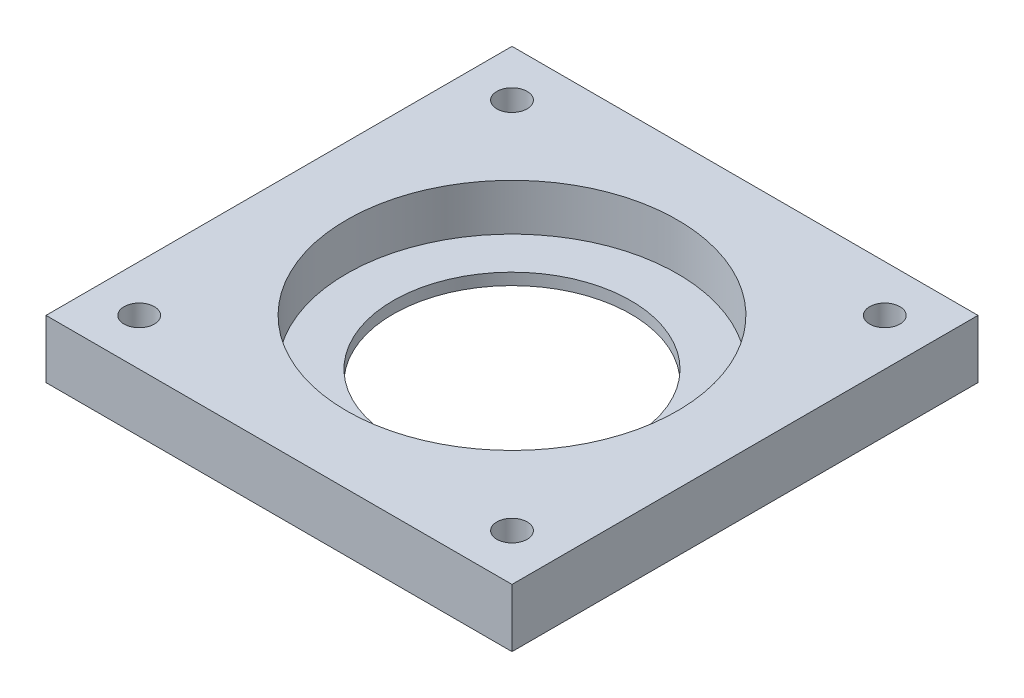
ISO-10303-21;
HEADER;
FILE_DESCRIPTION(('STEP AP214'),'2;1');
FILE_NAME('part.step','',(''),(''),'','','');
FILE_SCHEMA(('AUTOMOTIVE_DESIGN { 1 0 10303 214 1 1 1 1 }'));
ENDSEC;
DATA;
#1=APPLICATION_CONTEXT('core data for automotive mechanical design processes');
#2=APPLICATION_PROTOCOL_DEFINITION('international standard','automotive_design',2000,#1);
#3=PRODUCT_CONTEXT('',#1,'mechanical');
#4=PRODUCT('Part','Part','',(#3));
#5=PRODUCT_RELATED_PRODUCT_CATEGORY('part','',(#4));
#6=PRODUCT_DEFINITION_FORMATION('','',#4);
#7=PRODUCT_DEFINITION_CONTEXT('part definition',#1,'design');
#8=PRODUCT_DEFINITION('design','',#6,#7);
#9=PRODUCT_DEFINITION_SHAPE('','',#8);
#10=(LENGTH_UNIT() NAMED_UNIT(*) SI_UNIT(.MILLI.,.METRE.));
#11=(NAMED_UNIT(*) PLANE_ANGLE_UNIT() SI_UNIT($,.RADIAN.));
#12=(NAMED_UNIT(*) SI_UNIT($,.STERADIAN.) SOLID_ANGLE_UNIT());
#13=UNCERTAINTY_MEASURE_WITH_UNIT(LENGTH_MEASURE(1.E-05),#10,'distance_accuracy_value','');
#14=(GEOMETRIC_REPRESENTATION_CONTEXT(3) GLOBAL_UNCERTAINTY_ASSIGNED_CONTEXT((#13)) GLOBAL_UNIT_ASSIGNED_CONTEXT((#10,
#11,#12)) REPRESENTATION_CONTEXT('',''));
#15=CARTESIAN_POINT('',(0.,0.,0.));
#16=DIRECTION('',(0.,0.,1.));
#17=DIRECTION('',(1.,0.,0.));
#18=AXIS2_PLACEMENT_3D('',#15,#16,#17);
#19=CARTESIAN_POINT('',(50.,12.5,-50.));
#20=DIRECTION('',(-1.,0.,0.));
#21=DIRECTION('',(0.,0.,1.));
#22=AXIS2_PLACEMENT_3D('',#19,#20,#21);
#23=PLANE('',#22);
#24=DIRECTION('',(0.,0.,-1.));
#25=VECTOR('',#24,1.);
#26=CARTESIAN_POINT('',(50.,0.,-50.));
#27=LINE('',#26,#25);
#28=CARTESIAN_POINT('',(50.,0.,50.));
#29=VERTEX_POINT('',#28);
#30=CARTESIAN_POINT('',(50.,0.,-50.));
#31=VERTEX_POINT('',#30);
#32=EDGE_CURVE('E99',#29,#31,#27,.T.);
#33=ORIENTED_EDGE('',*,*,#32,.T.);
#34=DIRECTION('',(0.,-1.,0.));
#35=VECTOR('',#34,1.);
#36=CARTESIAN_POINT('',(50.,12.5,-50.));
#37=LINE('',#36,#35);
#38=CARTESIAN_POINT('',(50.,12.5,-50.));
#39=VERTEX_POINT('',#38);
#40=EDGE_CURVE('E11',#39,#31,#37,.T.);
#41=ORIENTED_EDGE('',*,*,#40,.F.);
#42=DIRECTION('',(0.,0.,-1.));
#43=VECTOR('',#42,1.);
#44=CARTESIAN_POINT('',(50.,12.5,-50.));
#45=LINE('',#44,#43);
#46=CARTESIAN_POINT('',(50.,12.5,50.));
#47=VERTEX_POINT('',#46);
#48=EDGE_CURVE('E87',#47,#39,#45,.T.);
#49=ORIENTED_EDGE('',*,*,#48,.F.);
#50=DIRECTION('',(0.,-1.,0.));
#51=VECTOR('',#50,1.);
#52=CARTESIAN_POINT('',(50.,12.5,50.));
#53=LINE('',#52,#51);
#54=EDGE_CURVE('E95',#47,#29,#53,.T.);
#55=ORIENTED_EDGE('',*,*,#54,.T.);
#56=EDGE_LOOP('',(#33,#41,#49,#55));
#57=FACE_BOUND('',#56,.T.);
#58=ADVANCED_FACE('F36',(#57),#23,.F.);
#59=CARTESIAN_POINT('',(-50.,12.5,-50.));
#60=DIRECTION('',(0.,0.,1.));
#61=DIRECTION('',(1.,0.,0.));
#62=AXIS2_PLACEMENT_3D('',#59,#60,#61);
#63=PLANE('',#62);
#64=DIRECTION('',(-1.,0.,0.));
#65=VECTOR('',#64,1.);
#66=CARTESIAN_POINT('',(-50.,0.,-50.));
#67=LINE('',#66,#65);
#68=CARTESIAN_POINT('',(-50.,0.,-50.));
#69=VERTEX_POINT('',#68);
#70=EDGE_CURVE('E91',#31,#69,#67,.T.);
#71=ORIENTED_EDGE('',*,*,#70,.T.);
#72=DIRECTION('',(0.,-1.,0.));
#73=VECTOR('',#72,1.);
#74=CARTESIAN_POINT('',(-50.,12.5,-50.));
#75=LINE('',#74,#73);
#76=CARTESIAN_POINT('',(-50.,12.5,-50.));
#77=VERTEX_POINT('',#76);
#78=EDGE_CURVE('E44',#77,#69,#75,.T.);
#79=ORIENTED_EDGE('',*,*,#78,.F.);
#80=DIRECTION('',(-1.,0.,0.));
#81=VECTOR('',#80,1.);
#82=CARTESIAN_POINT('',(-50.,12.5,-50.));
#83=LINE('',#82,#81);
#84=EDGE_CURVE('E82',#39,#77,#83,.T.);
#85=ORIENTED_EDGE('',*,*,#84,.F.);
#86=ORIENTED_EDGE('',*,*,#40,.T.);
#87=EDGE_LOOP('',(#71,#79,#85,#86));
#88=FACE_BOUND('',#87,.T.);
#89=ADVANCED_FACE('F90',(#88),#63,.F.);
#90=CARTESIAN_POINT('',(-50.,12.5,-50.));
#91=DIRECTION('',(1.,0.,0.));
#92=DIRECTION('',(0.,0.,-1.));
#93=AXIS2_PLACEMENT_3D('',#90,#91,#92);
#94=PLANE('',#93);
#95=DIRECTION('',(0.,0.,1.));
#96=VECTOR('',#95,1.);
#97=CARTESIAN_POINT('',(-50.,0.,-50.));
#98=LINE('',#97,#96);
#99=CARTESIAN_POINT('',(-50.,0.,50.));
#100=VERTEX_POINT('',#99);
#101=EDGE_CURVE('E69',#69,#100,#98,.T.);
#102=ORIENTED_EDGE('',*,*,#101,.T.);
#103=DIRECTION('',(0.,-1.,0.));
#104=VECTOR('',#103,1.);
#105=CARTESIAN_POINT('',(-50.,12.5,50.));
#106=LINE('',#105,#104);
#107=CARTESIAN_POINT('',(-50.,12.5,50.));
#108=VERTEX_POINT('',#107);
#109=EDGE_CURVE('E92',#108,#100,#106,.T.);
#110=ORIENTED_EDGE('',*,*,#109,.F.);
#111=DIRECTION('',(0.,0.,1.));
#112=VECTOR('',#111,1.);
#113=CARTESIAN_POINT('',(-50.,12.5,-50.));
#114=LINE('',#113,#112);
#115=EDGE_CURVE('E85',#77,#108,#114,.T.);
#116=ORIENTED_EDGE('',*,*,#115,.F.);
#117=ORIENTED_EDGE('',*,*,#78,.T.);
#118=EDGE_LOOP('',(#102,#110,#116,#117));
#119=FACE_BOUND('',#118,.T.);
#120=ADVANCED_FACE('F93',(#119),#94,.F.);
#121=CARTESIAN_POINT('',(-50.,12.5,50.));
#122=DIRECTION('',(0.,0.,-1.));
#123=DIRECTION('',(-1.,0.,0.));
#124=AXIS2_PLACEMENT_3D('',#121,#122,#123);
#125=PLANE('',#124);
#126=DIRECTION('',(1.,0.,0.));
#127=VECTOR('',#126,1.);
#128=CARTESIAN_POINT('',(-50.,0.,50.));
#129=LINE('',#128,#127);
#130=EDGE_CURVE('E75',#100,#29,#129,.T.);
#131=ORIENTED_EDGE('',*,*,#130,.T.);
#132=ORIENTED_EDGE('',*,*,#54,.F.);
#133=DIRECTION('',(1.,0.,0.));
#134=VECTOR('',#133,1.);
#135=CARTESIAN_POINT('',(-50.,12.5,50.));
#136=LINE('',#135,#134);
#137=EDGE_CURVE('E52',#108,#47,#136,.T.);
#138=ORIENTED_EDGE('',*,*,#137,.F.);
#139=ORIENTED_EDGE('',*,*,#109,.T.);
#140=EDGE_LOOP('',(#131,#132,#138,#139));
#141=FACE_BOUND('',#140,.T.);
#142=ADVANCED_FACE('F107',(#141),#125,.F.);
#143=CARTESIAN_POINT('',(0.,12.5,0.));
#144=DIRECTION('',(0.,1.,0.));
#145=DIRECTION('',(0.,0.,1.));
#146=AXIS2_PLACEMENT_3D('',#143,#144,#145);
#147=PLANE('',#146);
#148=CARTESIAN_POINT('',(-40.0000000000001,12.5,-39.9999999999999));
#149=DIRECTION('',(0.,1.,0.));
#150=DIRECTION('',(1.,0.,0.));
#151=AXIS2_PLACEMENT_3D('',#148,#149,#150);
#152=CIRCLE('',#151,3.25);
#153=CARTESIAN_POINT('',(-36.7500000000001,12.5,-39.9999999999999));
#154=VERTEX_POINT('',#153);
#155=EDGE_CURVE('E143',#154,#154,#152,.T.);
#156=ORIENTED_EDGE('',*,*,#155,.F.);
#157=EDGE_LOOP('',(#156));
#158=FACE_BOUND('',#157,.T.);
#159=CARTESIAN_POINT('',(-40.,12.5,40.));
#160=DIRECTION('',(0.,1.,0.));
#161=DIRECTION('',(0.,0.,-1.));
#162=AXIS2_PLACEMENT_3D('',#159,#160,#161);
#163=CIRCLE('',#162,3.25);
#164=CARTESIAN_POINT('',(-40.,12.5,36.75));
#165=VERTEX_POINT('',#164);
#166=EDGE_CURVE('E137',#165,#165,#163,.T.);
#167=ORIENTED_EDGE('',*,*,#166,.F.);
#168=EDGE_LOOP('',(#167));
#169=FACE_BOUND('',#168,.T.);
#170=CARTESIAN_POINT('',(40.0000000000004,12.5,39.9999999999996));
#171=DIRECTION('',(0.,1.,0.));
#172=DIRECTION('',(-1.,0.,0.));
#173=AXIS2_PLACEMENT_3D('',#170,#171,#172);
#174=CIRCLE('',#173,3.25);
#175=CARTESIAN_POINT('',(36.7500000000004,12.5,39.9999999999996));
#176=VERTEX_POINT('',#175);
#177=EDGE_CURVE('E131',#176,#176,#174,.T.);
#178=ORIENTED_EDGE('',*,*,#177,.F.);
#179=EDGE_LOOP('',(#178));
#180=FACE_BOUND('',#179,.T.);
#181=CARTESIAN_POINT('',(40.,12.5,-40.));
#182=DIRECTION('',(0.,1.,0.));
#183=DIRECTION('',(0.,0.,1.));
#184=AXIS2_PLACEMENT_3D('',#181,#182,#183);
#185=CIRCLE('',#184,3.25);
#186=CARTESIAN_POINT('',(40.,12.5,-36.75));
#187=VERTEX_POINT('',#186);
#188=EDGE_CURVE('E125',#187,#187,#185,.T.);
#189=ORIENTED_EDGE('',*,*,#188,.F.);
#190=EDGE_LOOP('',(#189));
#191=FACE_BOUND('',#190,.T.);
#192=CARTESIAN_POINT('',(0.,12.5,0.));
#193=DIRECTION('',(0.,1.,0.));
#194=DIRECTION('',(0.,0.,1.));
#195=AXIS2_PLACEMENT_3D('',#192,#193,#194);
#196=CIRCLE('',#195,35.5);
#197=CARTESIAN_POINT('',(0.,12.5,35.5));
#198=VERTEX_POINT('',#197);
#199=EDGE_CURVE('E113',#198,#198,#196,.T.);
#200=ORIENTED_EDGE('',*,*,#199,.F.);
#201=EDGE_LOOP('',(#200));
#202=FACE_BOUND('',#201,.T.);
#203=ORIENTED_EDGE('',*,*,#48,.T.);
#204=ORIENTED_EDGE('',*,*,#84,.T.);
#205=ORIENTED_EDGE('',*,*,#115,.T.);
#206=ORIENTED_EDGE('',*,*,#137,.T.);
#207=EDGE_LOOP('',(#203,#204,#205,#206));
#208=FACE_BOUND('',#207,.T.);
#209=ADVANCED_FACE('F83',(#158,#169,#180,#191,#202,#208),#147,.T.);
#210=CARTESIAN_POINT('',(0.,0.,0.));
#211=DIRECTION('',(0.,1.,0.));
#212=DIRECTION('',(0.,0.,1.));
#213=AXIS2_PLACEMENT_3D('',#210,#211,#212);
#214=PLANE('',#213);
#215=CARTESIAN_POINT('',(-40.0000000000001,0.,-39.9999999999999));
#216=DIRECTION('',(0.,1.,0.));
#217=DIRECTION('',(1.,0.,0.));
#218=AXIS2_PLACEMENT_3D('',#215,#216,#217);
#219=CIRCLE('',#218,3.25);
#220=CARTESIAN_POINT('',(-36.7500000000001,0.,-39.9999999999999));
#221=VERTEX_POINT('',#220);
#222=EDGE_CURVE('E128',#221,#221,#219,.T.);
#223=ORIENTED_EDGE('',*,*,#222,.T.);
#224=EDGE_LOOP('',(#223));
#225=FACE_BOUND('',#224,.T.);
#226=CARTESIAN_POINT('',(-40.,0.,40.));
#227=DIRECTION('',(0.,1.,0.));
#228=DIRECTION('',(0.,0.,-1.));
#229=AXIS2_PLACEMENT_3D('',#226,#227,#228);
#230=CIRCLE('',#229,3.25);
#231=CARTESIAN_POINT('',(-40.,0.,36.75));
#232=VERTEX_POINT('',#231);
#233=EDGE_CURVE('E140',#232,#232,#230,.T.);
#234=ORIENTED_EDGE('',*,*,#233,.T.);
#235=EDGE_LOOP('',(#234));
#236=FACE_BOUND('',#235,.T.);
#237=CARTESIAN_POINT('',(40.0000000000004,0.,39.9999999999996));
#238=DIRECTION('',(0.,1.,0.));
#239=DIRECTION('',(-1.,0.,0.));
#240=AXIS2_PLACEMENT_3D('',#237,#238,#239);
#241=CIRCLE('',#240,3.25);
#242=CARTESIAN_POINT('',(36.7500000000004,0.,39.9999999999996));
#243=VERTEX_POINT('',#242);
#244=EDGE_CURVE('E134',#243,#243,#241,.T.);
#245=ORIENTED_EDGE('',*,*,#244,.T.);
#246=EDGE_LOOP('',(#245));
#247=FACE_BOUND('',#246,.T.);
#248=CARTESIAN_POINT('',(40.,0.,-40.));
#249=DIRECTION('',(0.,1.,0.));
#250=DIRECTION('',(0.,0.,1.));
#251=AXIS2_PLACEMENT_3D('',#248,#249,#250);
#252=CIRCLE('',#251,3.25);
#253=CARTESIAN_POINT('',(40.,0.,-36.75));
#254=VERTEX_POINT('',#253);
#255=EDGE_CURVE('E122',#254,#254,#252,.T.);
#256=ORIENTED_EDGE('',*,*,#255,.T.);
#257=EDGE_LOOP('',(#256));
#258=FACE_BOUND('',#257,.T.);
#259=CARTESIAN_POINT('',(0.,0.,0.));
#260=DIRECTION('',(0.,1.,0.));
#261=DIRECTION('',(0.,0.,1.));
#262=AXIS2_PLACEMENT_3D('',#259,#260,#261);
#263=CIRCLE('',#262,25.5);
#264=CARTESIAN_POINT('',(0.,0.,25.5));
#265=VERTEX_POINT('',#264);
#266=EDGE_CURVE('E116',#265,#265,#263,.T.);
#267=ORIENTED_EDGE('',*,*,#266,.T.);
#268=EDGE_LOOP('',(#267));
#269=FACE_BOUND('',#268,.T.);
#270=ORIENTED_EDGE('',*,*,#32,.F.);
#271=ORIENTED_EDGE('',*,*,#130,.F.);
#272=ORIENTED_EDGE('',*,*,#101,.F.);
#273=ORIENTED_EDGE('',*,*,#70,.F.);
#274=EDGE_LOOP('',(#270,#271,#272,#273));
#275=FACE_BOUND('',#274,.T.);
#276=ADVANCED_FACE('F110',(#225,#236,#247,#258,#269,#275),#214,.F.);
#277=CARTESIAN_POINT('',(0.,2.5,0.));
#278=DIRECTION('',(0.,1.,0.));
#279=DIRECTION('',(0.,0.,1.));
#280=AXIS2_PLACEMENT_3D('',#277,#278,#279);
#281=CYLINDRICAL_SURFACE('',#280,35.5);
#282=CARTESIAN_POINT('',(0.,2.5,0.));
#283=DIRECTION('',(0.,1.,0.));
#284=DIRECTION('',(0.,0.,1.));
#285=AXIS2_PLACEMENT_3D('',#282,#283,#284);
#286=CIRCLE('',#285,35.5);
#287=CARTESIAN_POINT('',(0.,2.5,35.5));
#288=VERTEX_POINT('',#287);
#289=EDGE_CURVE('E102',#288,#288,#286,.T.);
#290=ORIENTED_EDGE('',*,*,#289,.F.);
#291=EDGE_LOOP('',(#290));
#292=FACE_BOUND('',#291,.T.);
#293=ORIENTED_EDGE('',*,*,#199,.T.);
#294=EDGE_LOOP('',(#293));
#295=FACE_BOUND('',#294,.T.);
#296=ADVANCED_FACE('F169',(#292,#295),#281,.F.);
#297=CARTESIAN_POINT('',(0.,2.5,0.));
#298=DIRECTION('',(0.,1.,0.));
#299=DIRECTION('',(0.,0.,1.));
#300=AXIS2_PLACEMENT_3D('',#297,#298,#299);
#301=PLANE('',#300);
#302=CARTESIAN_POINT('',(0.,2.5,0.));
#303=DIRECTION('',(0.,1.,0.));
#304=DIRECTION('',(0.,0.,1.));
#305=AXIS2_PLACEMENT_3D('',#302,#303,#304);
#306=CIRCLE('',#305,25.5);
#307=CARTESIAN_POINT('',(0.,2.5,25.5));
#308=VERTEX_POINT('',#307);
#309=EDGE_CURVE('E119',#308,#308,#306,.T.);
#310=ORIENTED_EDGE('',*,*,#309,.F.);
#311=EDGE_LOOP('',(#310));
#312=FACE_BOUND('',#311,.T.);
#313=ORIENTED_EDGE('',*,*,#289,.T.);
#314=EDGE_LOOP('',(#313));
#315=FACE_BOUND('',#314,.T.);
#316=ADVANCED_FACE('F171',(#312,#315),#301,.T.);
#317=CARTESIAN_POINT('',(0.,0.,0.));
#318=DIRECTION('',(0.,1.,0.));
#319=DIRECTION('',(0.,0.,1.));
#320=AXIS2_PLACEMENT_3D('',#317,#318,#319);
#321=CYLINDRICAL_SURFACE('',#320,25.5);
#322=ORIENTED_EDGE('',*,*,#266,.F.);
#323=EDGE_LOOP('',(#322));
#324=FACE_BOUND('',#323,.T.);
#325=ORIENTED_EDGE('',*,*,#309,.T.);
#326=EDGE_LOOP('',(#325));
#327=FACE_BOUND('',#326,.T.);
#328=ADVANCED_FACE('F178',(#324,#327),#321,.F.);
#329=CARTESIAN_POINT('',(40.,0.,-40.));
#330=DIRECTION('',(0.,1.,0.));
#331=DIRECTION('',(0.,0.,1.));
#332=AXIS2_PLACEMENT_3D('',#329,#330,#331);
#333=CYLINDRICAL_SURFACE('',#332,3.25);
#334=ORIENTED_EDGE('',*,*,#255,.F.);
#335=EDGE_LOOP('',(#334));
#336=FACE_BOUND('',#335,.T.);
#337=ORIENTED_EDGE('',*,*,#188,.T.);
#338=EDGE_LOOP('',(#337));
#339=FACE_BOUND('',#338,.T.);
#340=ADVANCED_FACE('F218',(#336,#339),#333,.F.);
#341=CARTESIAN_POINT('',(40.0000000000004,0.,39.9999999999996));
#342=DIRECTION('',(0.,1.,0.));
#343=DIRECTION('',(0.,0.,1.));
#344=AXIS2_PLACEMENT_3D('',#341,#342,#343);
#345=CYLINDRICAL_SURFACE('',#344,3.25);
#346=ORIENTED_EDGE('',*,*,#244,.F.);
#347=EDGE_LOOP('',(#346));
#348=FACE_BOUND('',#347,.T.);
#349=ORIENTED_EDGE('',*,*,#177,.T.);
#350=EDGE_LOOP('',(#349));
#351=FACE_BOUND('',#350,.T.);
#352=ADVANCED_FACE('F213',(#348,#351),#345,.F.);
#353=CARTESIAN_POINT('',(-40.,0.,40.));
#354=DIRECTION('',(0.,1.,0.));
#355=DIRECTION('',(0.,0.,1.));
#356=AXIS2_PLACEMENT_3D('',#353,#354,#355);
#357=CYLINDRICAL_SURFACE('',#356,3.25);
#358=ORIENTED_EDGE('',*,*,#233,.F.);
#359=EDGE_LOOP('',(#358));
#360=FACE_BOUND('',#359,.T.);
#361=ORIENTED_EDGE('',*,*,#166,.T.);
#362=EDGE_LOOP('',(#361));
#363=FACE_BOUND('',#362,.T.);
#364=ADVANCED_FACE('F154',(#360,#363),#357,.F.);
#365=CARTESIAN_POINT('',(-40.0000000000001,0.,-39.9999999999999));
#366=DIRECTION('',(0.,1.,0.));
#367=DIRECTION('',(0.,0.,1.));
#368=AXIS2_PLACEMENT_3D('',#365,#366,#367);
#369=CYLINDRICAL_SURFACE('',#368,3.25);
#370=ORIENTED_EDGE('',*,*,#222,.F.);
#371=EDGE_LOOP('',(#370));
#372=FACE_BOUND('',#371,.T.);
#373=ORIENTED_EDGE('',*,*,#155,.T.);
#374=EDGE_LOOP('',(#373));
#375=FACE_BOUND('',#374,.T.);
#376=ADVANCED_FACE('F151',(#372,#375),#369,.F.);
#377=CLOSED_SHELL('',(#58,#89,#120,#142,#209,#276,#296,#316,#328,#340,#352,#364,#376));
#378=MANIFOLD_SOLID_BREP('B2',#377);
#379=ADVANCED_BREP_SHAPE_REPRESENTATION('',(#18,#378),#14);
#380=SHAPE_DEFINITION_REPRESENTATION(#9,#379);
ENDSEC;
END-ISO-10303-21;
